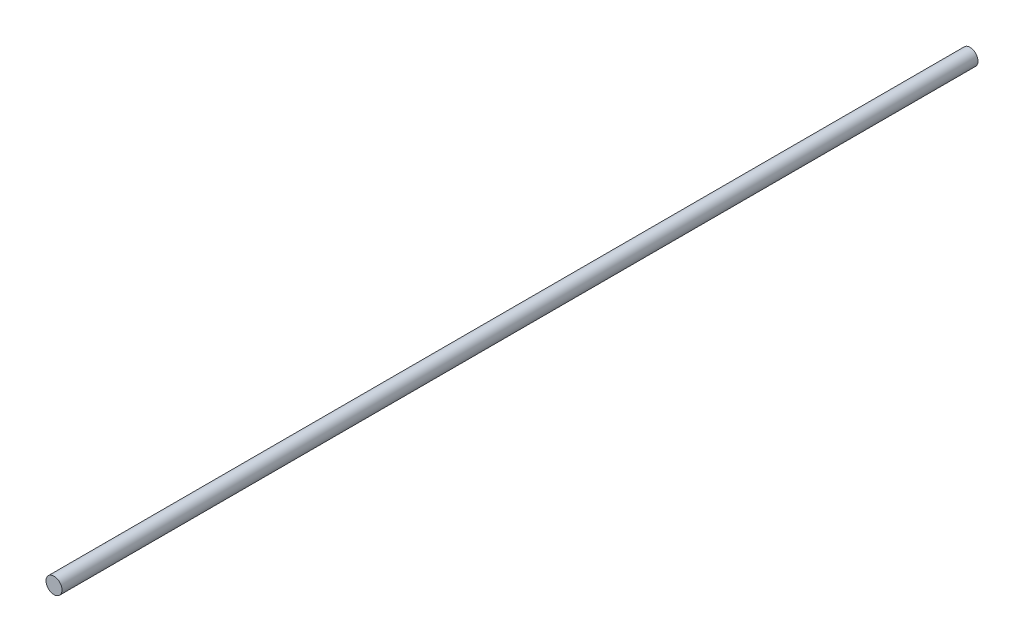
ISO-10303-21;
HEADER;
FILE_DESCRIPTION(('STEP AP214'),'2;1');
FILE_NAME('part.step','',(''),(''),'','','');
FILE_SCHEMA(('AUTOMOTIVE_DESIGN { 1 0 10303 214 1 1 1 1 }'));
ENDSEC;
DATA;
#1=APPLICATION_CONTEXT('core data for automotive mechanical design processes');
#2=APPLICATION_PROTOCOL_DEFINITION('international standard','automotive_design',2000,#1);
#3=PRODUCT_CONTEXT('',#1,'mechanical');
#4=PRODUCT('Part','Part','',(#3));
#5=PRODUCT_RELATED_PRODUCT_CATEGORY('part','',(#4));
#6=PRODUCT_DEFINITION_FORMATION('','',#4);
#7=PRODUCT_DEFINITION_CONTEXT('part definition',#1,'design');
#8=PRODUCT_DEFINITION('design','',#6,#7);
#9=PRODUCT_DEFINITION_SHAPE('','',#8);
#10=(LENGTH_UNIT() NAMED_UNIT(*) SI_UNIT(.MILLI.,.METRE.));
#11=(NAMED_UNIT(*) PLANE_ANGLE_UNIT() SI_UNIT($,.RADIAN.));
#12=(NAMED_UNIT(*) SI_UNIT($,.STERADIAN.) SOLID_ANGLE_UNIT());
#13=UNCERTAINTY_MEASURE_WITH_UNIT(LENGTH_MEASURE(1.E-05),#10,'distance_accuracy_value','');
#14=(GEOMETRIC_REPRESENTATION_CONTEXT(3) GLOBAL_UNCERTAINTY_ASSIGNED_CONTEXT((#13)) GLOBAL_UNIT_ASSIGNED_CONTEXT((#10,
#11,#12)) REPRESENTATION_CONTEXT('',''));
#15=CARTESIAN_POINT('',(0.,0.,0.));
#16=DIRECTION('',(0.,0.,1.));
#17=DIRECTION('',(1.,0.,0.));
#18=AXIS2_PLACEMENT_3D('',#15,#16,#17);
#19=CARTESIAN_POINT('',(0.,0.,286.));
#20=DIRECTION('',(0.,0.,-1.));
#21=DIRECTION('',(-1.,0.,0.));
#22=AXIS2_PLACEMENT_3D('',#19,#20,#21);
#23=CYLINDRICAL_SURFACE('',#22,2.5);
#24=CARTESIAN_POINT('',(0.,0.,286.));
#25=DIRECTION('',(0.,0.,1.));
#26=DIRECTION('',(1.,0.,0.));
#27=AXIS2_PLACEMENT_3D('',#24,#25,#26);
#28=CIRCLE('',#27,2.5);
#29=CARTESIAN_POINT('',(2.5,0.,286.));
#30=VERTEX_POINT('',#29);
#31=EDGE_CURVE('E10',#30,#30,#28,.T.);
#32=ORIENTED_EDGE('',*,*,#31,.F.);
#33=EDGE_LOOP('',(#32));
#34=FACE_BOUND('',#33,.T.);
#35=CARTESIAN_POINT('',(0.,0.,0.));
#36=DIRECTION('',(0.,0.,1.));
#37=DIRECTION('',(1.,0.,0.));
#38=AXIS2_PLACEMENT_3D('',#35,#36,#37);
#39=CIRCLE('',#38,2.5);
#40=CARTESIAN_POINT('',(2.5,0.,0.));
#41=VERTEX_POINT('',#40);
#42=EDGE_CURVE('E35',#41,#41,#39,.T.);
#43=ORIENTED_EDGE('',*,*,#42,.T.);
#44=EDGE_LOOP('',(#43));
#45=FACE_BOUND('',#44,.T.);
#46=ADVANCED_FACE('F32',(#34,#45),#23,.T.);
#47=CARTESIAN_POINT('',(0.,0.,286.));
#48=DIRECTION('',(0.,0.,1.));
#49=DIRECTION('',(1.,0.,0.));
#50=AXIS2_PLACEMENT_3D('',#47,#48,#49);
#51=PLANE('',#50);
#52=ORIENTED_EDGE('',*,*,#31,.T.);
#53=EDGE_LOOP('',(#52));
#54=FACE_BOUND('',#53,.T.);
#55=ADVANCED_FACE('F47',(#54),#51,.T.);
#56=CARTESIAN_POINT('',(0.,0.,0.));
#57=DIRECTION('',(0.,0.,1.));
#58=DIRECTION('',(1.,0.,0.));
#59=AXIS2_PLACEMENT_3D('',#56,#57,#58);
#60=PLANE('',#59);
#61=ORIENTED_EDGE('',*,*,#42,.F.);
#62=EDGE_LOOP('',(#61));
#63=FACE_BOUND('',#62,.T.);
#64=ADVANCED_FACE('F45',(#63),#60,.F.);
#65=CLOSED_SHELL('',(#46,#55,#64));
#66=MANIFOLD_SOLID_BREP('B2',#65);
#67=ADVANCED_BREP_SHAPE_REPRESENTATION('',(#18,#66),#14);
#68=SHAPE_DEFINITION_REPRESENTATION(#9,#67);
ENDSEC;
END-ISO-10303-21;
